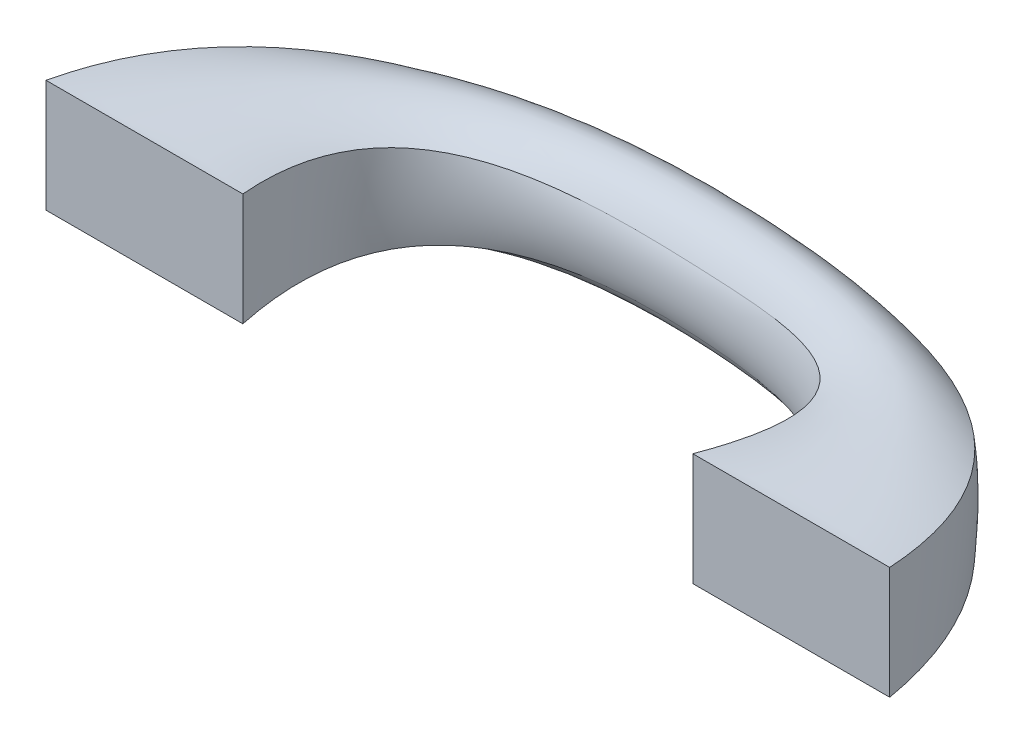
ISO-10303-21;
HEADER;
FILE_DESCRIPTION(('STEP AP214'),'2;1');
FILE_NAME('part.step','',(''),(''),'','','');
FILE_SCHEMA(('AUTOMOTIVE_DESIGN { 1 0 10303 214 1 1 1 1 }'));
ENDSEC;
DATA;
#1=APPLICATION_CONTEXT('core data for automotive mechanical design processes');
#2=APPLICATION_PROTOCOL_DEFINITION('international standard','automotive_design',2000,#1);
#3=PRODUCT_CONTEXT('',#1,'mechanical');
#4=PRODUCT('Part','Part','',(#3));
#5=PRODUCT_RELATED_PRODUCT_CATEGORY('part','',(#4));
#6=PRODUCT_DEFINITION_FORMATION('','',#4);
#7=PRODUCT_DEFINITION_CONTEXT('part definition',#1,'design');
#8=PRODUCT_DEFINITION('design','',#6,#7);
#9=PRODUCT_DEFINITION_SHAPE('','',#8);
#10=(LENGTH_UNIT() NAMED_UNIT(*) SI_UNIT(.MILLI.,.METRE.));
#11=(NAMED_UNIT(*) PLANE_ANGLE_UNIT() SI_UNIT($,.RADIAN.));
#12=(NAMED_UNIT(*) SI_UNIT($,.STERADIAN.) SOLID_ANGLE_UNIT());
#13=UNCERTAINTY_MEASURE_WITH_UNIT(LENGTH_MEASURE(1.E-05),#10,'distance_accuracy_value','');
#14=(GEOMETRIC_REPRESENTATION_CONTEXT(3) GLOBAL_UNCERTAINTY_ASSIGNED_CONTEXT((#13)) GLOBAL_UNIT_ASSIGNED_CONTEXT((#10,
#11,#12)) REPRESENTATION_CONTEXT('',''));
#15=CARTESIAN_POINT('',(0.,0.,0.));
#16=DIRECTION('',(0.,0.,1.));
#17=DIRECTION('',(1.,0.,0.));
#18=AXIS2_PLACEMENT_3D('',#15,#16,#17);
#19=CARTESIAN_POINT('',(0.,0.,0.));
#20=DIRECTION('',(0.,0.,1.));
#21=DIRECTION('',(1.,0.,0.));
#22=AXIS2_PLACEMENT_3D('',#19,#20,#21);
#23=PLANE('',#22);
#24=DIRECTION('',(0.,-1.,0.));
#25=VECTOR('',#24,1.);
#26=CARTESIAN_POINT('',(31.5014319167935,10.,0.));
#27=LINE('',#26,#25);
#28=CARTESIAN_POINT('',(31.5014319167935,10.,0.));
#29=VERTEX_POINT('',#28);
#30=CARTESIAN_POINT('',(31.5014319167935,-10.,0.));
#31=VERTEX_POINT('',#30);
#32=EDGE_CURVE('E211',#29,#31,#27,.T.);
#33=ORIENTED_EDGE('',*,*,#32,.T.);
#34=DIRECTION('',(1.,0.,0.));
#35=VECTOR('',#34,1.);
#36=CARTESIAN_POINT('',(31.5014319167935,-10.,0.));
#37=LINE('',#36,#35);
#38=CARTESIAN_POINT('',(66.5014319167935,-10.,0.));
#39=VERTEX_POINT('',#38);
#40=EDGE_CURVE('E215',#31,#39,#37,.T.);
#41=ORIENTED_EDGE('',*,*,#40,.T.);
#42=DIRECTION('',(0.,-1.,0.));
#43=VECTOR('',#42,1.);
#44=CARTESIAN_POINT('',(66.5014319167935,10.,0.));
#45=LINE('',#44,#43);
#46=CARTESIAN_POINT('',(66.5014319167935,10.,0.));
#47=VERTEX_POINT('',#46);
#48=EDGE_CURVE('E146',#47,#39,#45,.T.);
#49=ORIENTED_EDGE('',*,*,#48,.F.);
#50=DIRECTION('',(1.,0.,0.));
#51=VECTOR('',#50,1.);
#52=CARTESIAN_POINT('',(31.5014319167935,10.,0.));
#53=LINE('',#52,#51);
#54=EDGE_CURVE('E13',#29,#47,#53,.T.);
#55=ORIENTED_EDGE('',*,*,#54,.F.);
#56=EDGE_LOOP('',(#33,#41,#49,#55));
#57=FACE_BOUND('',#56,.T.);
#58=ADVANCED_FACE('F135',(#57),#23,.T.);
#59=CARTESIAN_POINT('',(0.,0.,0.));
#60=DIRECTION('',(0.,0.,1.));
#61=DIRECTION('',(1.,0.,0.));
#62=AXIS2_PLACEMENT_3D('',#59,#60,#61);
#63=PLANE('',#62);
#64=DIRECTION('',(0.,-1.,0.));
#65=VECTOR('',#64,1.);
#66=CARTESIAN_POINT('',(-83.4985680832065,10.,0.));
#67=LINE('',#66,#65);
#68=CARTESIAN_POINT('',(-83.4985680832065,10.,0.));
#69=VERTEX_POINT('',#68);
#70=CARTESIAN_POINT('',(-83.4985680832065,-10.,0.));
#71=VERTEX_POINT('',#70);
#72=EDGE_CURVE('E186',#69,#71,#67,.T.);
#73=ORIENTED_EDGE('',*,*,#72,.T.);
#74=DIRECTION('',(1.,0.,0.));
#75=VECTOR('',#74,1.);
#76=CARTESIAN_POINT('',(-83.4985680832065,-10.,0.));
#77=LINE('',#76,#75);
#78=CARTESIAN_POINT('',(-48.4985680832065,-10.,0.));
#79=VERTEX_POINT('',#78);
#80=EDGE_CURVE('E204',#71,#79,#77,.T.);
#81=ORIENTED_EDGE('',*,*,#80,.T.);
#82=DIRECTION('',(0.,-1.,0.));
#83=VECTOR('',#82,1.);
#84=CARTESIAN_POINT('',(-48.4985680832065,10.,0.));
#85=LINE('',#84,#83);
#86=CARTESIAN_POINT('',(-48.4985680832065,10.,0.));
#87=VERTEX_POINT('',#86);
#88=EDGE_CURVE('E188',#87,#79,#85,.T.);
#89=ORIENTED_EDGE('',*,*,#88,.F.);
#90=DIRECTION('',(1.,0.,0.));
#91=VECTOR('',#90,1.);
#92=CARTESIAN_POINT('',(-83.4985680832065,10.,0.));
#93=LINE('',#92,#91);
#94=EDGE_CURVE('E182',#69,#87,#93,.T.);
#95=ORIENTED_EDGE('',*,*,#94,.F.);
#96=EDGE_LOOP('',(#73,#81,#89,#95));
#97=FACE_BOUND('',#96,.T.);
#98=ADVANCED_FACE('F184',(#97),#63,.T.);
#99=CARTESIAN_POINT('',(-83.4985680832065,-10.,0.));
#100=CARTESIAN_POINT('',(-77.4919509848669,-7.56626341636347,-39.5340383100525));
#101=CARTESIAN_POINT('',(-3.86637231656519,-3.06805673692634,-55.9145125137412));
#102=CARTESIAN_POINT('',(62.3199675792694,-7.81936699573573,-34.8892264525427));
#103=CARTESIAN_POINT('',(66.5014319167935,-10.,0.));
#104=CARTESIAN_POINT('',(-83.4985680832065,-9.12859632873898,0.));
#105=CARTESIAN_POINT('',(-77.4919509848669,-6.95278307562805,-39.6322478950513));
#106=CARTESIAN_POINT('',(-3.86637231656519,-2.9312888127908,-56.1942401045079));
#107=CARTESIAN_POINT('',(62.3199675792694,-7.17906316120128,-34.9772224434907));
#108=CARTESIAN_POINT('',(66.5014319167935,-9.12859632873898,0.));
#109=CARTESIAN_POINT('',(-83.4985680832065,-7.42683665929627,0.));
#110=CARTESIAN_POINT('',(-77.4919509848669,-5.71784874571408,-39.8120681331774));
#111=CARTESIAN_POINT('',(-3.8663723165652,-2.55917459024483,-56.706417016596));
#112=CARTESIAN_POINT('',(62.3199675792694,-5.89557995990541,-35.1383417481554));
#113=CARTESIAN_POINT('',(66.5014319167935,-7.42683665929627,0.));
#114=CARTESIAN_POINT('',(-83.4985680832066,-4.94177169735341,0.));
#115=CARTESIAN_POINT('',(-77.491950984867,-3.83066059391897,-40.0154071138067));
#116=CARTESIAN_POINT('',(-3.86637231656515,-1.77702528241067,-57.2855816995656));
#117=CARTESIAN_POINT('',(62.3199675792694,-3.946213854387,-35.3205338946658));
#118=CARTESIAN_POINT('',(66.5014319167935,-4.94177169735341,0.));
#119=CARTESIAN_POINT('',(-83.4985680832065,-2.48199814475246,0.));
#120=CARTESIAN_POINT('',(-77.4919509848669,-1.91770637870666,-40.1388244817071));
#121=CARTESIAN_POINT('',(-3.86637231656521,-0.874741824430276,-57.6371079073383));
#122=CARTESIAN_POINT('',(62.3199675792694,-1.97639155719178,-35.4311161111441));
#123=CARTESIAN_POINT('',(66.5014319167935,-2.48199814475246,0.));
#124=CARTESIAN_POINT('',(-83.4985680832065,-0.833333333325745,0.));
#125=CARTESIAN_POINT('',(-77.4919509848669,-0.638278027895398,-40.1648307803328));
#126=CARTESIAN_POINT('',(-3.86637231656519,-0.277762808768679,-57.7111809141575));
#127=CARTESIAN_POINT('',(62.3199675792694,-0.658563376898207,-35.4544178084121));
#128=CARTESIAN_POINT('',(66.5014319167935,-0.833333333325745,0.));
#129=CARTESIAN_POINT('',(-83.4985680832065,0.833333333340919,0.));
#130=CARTESIAN_POINT('',(-77.4919509848669,0.638278027907019,-40.1648307803328));
#131=CARTESIAN_POINT('',(-3.86637231656519,0.277762808773733,-57.7111809141575));
#132=CARTESIAN_POINT('',(62.3199675792694,0.658563376910197,-35.4544178084122));
#133=CARTESIAN_POINT('',(66.5014319167935,0.833333333340919,0.));
#134=CARTESIAN_POINT('',(-83.4985680832065,2.48199814477665,0.));
#135=CARTESIAN_POINT('',(-77.4919509848669,1.91770637871702,-40.1388244817087));
#136=CARTESIAN_POINT('',(-3.86637231656515,0.874741824415085,-57.6371079073428));
#137=CARTESIAN_POINT('',(62.3199675792693,1.97639155720359,-35.4311161111456));
#138=CARTESIAN_POINT('',(66.5014319167934,2.48199814477665,0.));
#139=CARTESIAN_POINT('',(-83.4985680832066,4.94177169736052,0.));
#140=CARTESIAN_POINT('',(-77.491950984867,3.83066059393323,-40.0154071138077));
#141=CARTESIAN_POINT('',(-3.86637231656521,1.77702528243814,-57.2855816995685));
#142=CARTESIAN_POINT('',(62.3199675792695,3.94621385440051,-35.3205338946667));
#143=CARTESIAN_POINT('',(66.5014319167936,4.94177169736052,0.));
#144=CARTESIAN_POINT('',(-83.4985680832065,7.42683665928213,0.));
#145=CARTESIAN_POINT('',(-77.4919509848669,5.7178487457288,-39.8120681331745));
#146=CARTESIAN_POINT('',(-3.86637231656516,2.5591745903129,-56.7064170165877));
#147=CARTESIAN_POINT('',(62.3199675792693,5.89557995991713,-35.1383417481528));
#148=CARTESIAN_POINT('',(66.5014319167934,7.42683665928213,0.));
#149=CARTESIAN_POINT('',(-83.4985680832065,9.12859632872681,0.));
#150=CARTESIAN_POINT('',(-77.4919509848669,6.95278307563979,-39.6322478950489));
#151=CARTESIAN_POINT('',(-3.86637231656518,2.93128881284676,-56.1942401045012));
#152=CARTESIAN_POINT('',(62.3199675792694,7.17906316121054,-34.9772224434886));
#153=CARTESIAN_POINT('',(66.5014319167935,9.12859632872681,0.));
#154=CARTESIAN_POINT('',(-83.4985680832065,10.,0.));
#155=CARTESIAN_POINT('',(-77.4919509848669,7.56626341637603,-39.5340383100525));
#156=CARTESIAN_POINT('',(-3.86637231656519,3.06805673696212,-55.9145125137412));
#157=CARTESIAN_POINT('',(62.3199675792694,7.81936699574699,-34.8892264525427));
#158=CARTESIAN_POINT('',(66.5014319167935,10.,0.));
#159=B_SPLINE_SURFACE_WITH_KNOTS('',3,3,((#99,#100,#101,#102,#103),(#104,#105,#106,#107,#108),
(#109,#110,#111,#112,#113),(#114,#115,#116,#117,#118),(#119,#120,#121,#122,#123),(#124,#125,
#126,#127,#128),(#129,#130,#131,#132,#133),(#134,#135,#136,#137,#138),(#139,#140,#141,#142,
#143),(#144,#145,#146,#147,#148),(#149,#150,#151,#152,#153),(#154,#155,#156,#157,#158)),
.UNSPECIFIED.,.F.,.F.,.F.,(4,1,1,1,2,1,1,1,4),(4,1,4),(0.811441776840538,0.835011554735256,
0.858581332629974,0.882151110524693,0.905720888419411,0.929290666314558,0.952860444209706,
0.976430222104853,1.),(0.,0.541045967221112,1.),.UNSPECIFIED.);
#160=CARTESIAN_POINT('',(-83.4985680832065,10.,0.));
#161=CARTESIAN_POINT('',(-77.4919509848669,7.56626341637603,-39.5340383100525));
#162=CARTESIAN_POINT('',(-3.86637231656519,3.06805673696212,-55.9145125137412));
#163=CARTESIAN_POINT('',(62.3199675792694,7.81936699574699,-34.8892264525427));
#164=CARTESIAN_POINT('',(66.5014319167935,10.,0.));
#165=B_SPLINE_CURVE_WITH_KNOTS('',3,(#160,#161,#162,#163,#164),.UNSPECIFIED.,.F.,.F.,(4,1,4),
(0.,0.541045967221112,1.),.UNSPECIFIED.);
#166=EDGE_CURVE('E154',#69,#47,#165,.T.);
#167=CARTESIAN_POINT('',(-83.4985680832065,-10.,0.));
#168=CARTESIAN_POINT('',(-77.4919509848669,-7.56626341636347,-39.5340383100525));
#169=CARTESIAN_POINT('',(-3.86637231656519,-3.06805673692634,-55.9145125137412));
#170=CARTESIAN_POINT('',(62.3199675792694,-7.81936699573573,-34.8892264525427));
#171=CARTESIAN_POINT('',(66.5014319167935,-10.,0.));
#172=B_SPLINE_CURVE_WITH_KNOTS('',3,(#167,#168,#169,#170,#171),.UNSPECIFIED.,.F.,.F.,(4,1,4),
(0.,0.541045967221112,1.),.UNSPECIFIED.);
#173=EDGE_CURVE('E202',#71,#39,#172,.T.);
#174=ORIENTED_EDGE('',*,*,#72,.F.);
#175=ORIENTED_EDGE('',*,*,#166,.T.);
#176=ORIENTED_EDGE('',*,*,#48,.T.);
#177=ORIENTED_EDGE('',*,*,#173,.F.);
#178=EDGE_LOOP('',(#174,#175,#176,#177));
#179=FACE_BOUND('',#178,.T.);
#180=ADVANCED_FACE('F200',(#179),#159,.T.);
#181=CARTESIAN_POINT('',(-48.4985680832065,-10.,0.));
#182=CARTESIAN_POINT('',(-53.5940938497763,-7.56626341636347,-32.8484546423258));
#183=CARTESIAN_POINT('',(-0.488292681954813,-3.06805673692633,-36.8721531323634));
#184=CARTESIAN_POINT('',(39.3928458351145,-7.81936699573573,-28.8989296814636));
#185=CARTESIAN_POINT('',(31.5014319167935,-10.,0.));
#186=CARTESIAN_POINT('',(-49.9569014165398,-10.,0.));
#187=CARTESIAN_POINT('',(-54.5898378970717,-7.89369106204627,-33.0062733703706));
#188=CARTESIAN_POINT('',(-0.629046000063579,-4.0006596644147,-37.3216637638807));
#189=CARTESIAN_POINT('',(40.3481425744543,-8.11274284235985,-29.0403355876654));
#190=CARTESIAN_POINT('',(32.9597652501268,-10.,0.));
#191=CARTESIAN_POINT('',(-52.8735680832065,-10.,0.));
#192=CARTESIAN_POINT('',(-56.5813259916626,-8.51920788837742,-33.383995967095));
#193=CARTESIAN_POINT('',(-0.910552636281107,-5.78230159698014,-38.3975203817574));
#194=CARTESIAN_POINT('',(42.2587360531338,-8.67320721035739,-29.3787758142748));
#195=CARTESIAN_POINT('',(35.8764319167935,-10.,0.));
#196=CARTESIAN_POINT('',(-57.2485680832065,-10.,0.));
#197=CARTESIAN_POINT('',(-59.568558133549,-9.30980509677256,-34.1470019748194));
#198=CARTESIAN_POINT('',(-1.3328125906074,-8.0341373253771,-40.5707688715456));
#199=CARTESIAN_POINT('',(45.1246262711532,-9.38158394155218,-30.0624307726967));
#200=CARTESIAN_POINT('',(40.2514319167935,-10.,0.));
#201=CARTESIAN_POINT('',(-61.6235680832065,-10.,0.));
#202=CARTESIAN_POINT('',(-62.5557902754353,-9.86359850337151,-35.1014639604233));
#203=CARTESIAN_POINT('',(-1.75507254493371,-9.61149146461275,-43.2893360227533));
#204=CARTESIAN_POINT('',(47.9905164891726,-9.87778397737085,-30.9176306826284));
#205=CARTESIAN_POINT('',(44.6264319167935,-10.,0.));
#206=CARTESIAN_POINT('',(-65.9985680832065,-9.99999999999999,0.));
#207=CARTESIAN_POINT('',(-65.5430224173216,-10.0685601369482,-36.1912464761891));
#208=CARTESIAN_POINT('',(-2.17733249926001,-10.1952779042026,-46.3933328230522));
#209=CARTESIAN_POINT('',(50.856406707192,-10.0614300242727,-31.8940780670031));
#210=CARTESIAN_POINT('',(49.0014319167935,-9.99999999999999,0.));
#211=CARTESIAN_POINT('',(-70.3735680832065,-10.,0.));
#212=CARTESIAN_POINT('',(-68.5302545592079,-9.86359850337152,-37.2810289919551));
#213=CARTESIAN_POINT('',(-2.5995924535863,-9.61149146461277,-49.4973296233515));
#214=CARTESIAN_POINT('',(53.7222969252113,-9.87778397737085,-32.870525451378));
#215=CARTESIAN_POINT('',(53.3764319167935,-10.,0.));
#216=CARTESIAN_POINT('',(-74.7485680832065,-10.,0.));
#217=CARTESIAN_POINT('',(-71.5174867010943,-9.30980509677254,-38.2354909775588));
#218=CARTESIAN_POINT('',(-3.02185240791258,-8.03413732537705,-52.2158967745588));
#219=CARTESIAN_POINT('',(56.5881871432307,-9.38158394155217,-33.7257253613096));
#220=CARTESIAN_POINT('',(57.7514319167935,-10.,0.));
#221=CARTESIAN_POINT('',(-79.1235680832065,-10.,0.));
#222=CARTESIAN_POINT('',(-74.5047188429806,-8.51920788837744,-38.9984969852834));
#223=CARTESIAN_POINT('',(-3.44411236223889,-5.7823015969802,-54.3891452643473));
#224=CARTESIAN_POINT('',(59.45407736125,-8.67320721035741,-34.4093803197316));
#225=CARTESIAN_POINT('',(62.1264319167935,-10.,0.));
#226=CARTESIAN_POINT('',(-82.0402347498732,-10.,0.));
#227=CARTESIAN_POINT('',(-76.4962069375715,-7.89369106204628,-39.3762195820077));
#228=CARTESIAN_POINT('',(-3.72561899845642,-4.00065966441471,-55.4650018822239));
#229=CARTESIAN_POINT('',(61.3646708399296,-8.11274284235985,-34.7478205463409));
#230=CARTESIAN_POINT('',(65.0430985834602,-10.,0.));
#231=CARTESIAN_POINT('',(-83.4985680832065,-10.,0.));
#232=CARTESIAN_POINT('',(-77.4919509848669,-7.56626341636347,-39.5340383100525));
#233=CARTESIAN_POINT('',(-3.86637231656519,-3.06805673692634,-55.9145125137412));
#234=CARTESIAN_POINT('',(62.3199675792694,-7.81936699573573,-34.8892264525427));
#235=CARTESIAN_POINT('',(66.5014319167935,-10.,0.));
#236=B_SPLINE_SURFACE_WITH_KNOTS('',3,3,((#181,#182,#183,#184,#185),(#186,#187,#188,#189,#190),
(#191,#192,#193,#194,#195),(#196,#197,#198,#199,#200),(#201,#202,#203,#204,#205),(#206,#207,
#208,#209,#210),(#211,#212,#213,#214,#215),(#216,#217,#218,#219,#220),(#221,#222,#223,#224,
#225),(#226,#227,#228,#229,#230),(#231,#232,#233,#234,#235)),.UNSPECIFIED.,.F.,.F.,.F.,(4,1,1,1,
1,1,1,1,4),(4,1,4),(0.50000000373556,0.538930225373682,0.577860447011805,0.616790668649927,
0.655720890288049,0.694651111926171,0.733581333564293,0.772511555202416,0.811441776840538),(0.,
0.541045967221112,1.),.UNSPECIFIED.);
#237=CARTESIAN_POINT('',(-48.4985680832065,-10.,0.));
#238=CARTESIAN_POINT('',(-53.5940938497763,-7.56626341636347,-32.8484546423258));
#239=CARTESIAN_POINT('',(-0.488292681954813,-3.06805673692633,-36.8721531323634));
#240=CARTESIAN_POINT('',(39.3928458351145,-7.81936699573573,-28.8989296814636));
#241=CARTESIAN_POINT('',(31.5014319167935,-10.,0.));
#242=B_SPLINE_CURVE_WITH_KNOTS('',3,(#237,#238,#239,#240,#241),.UNSPECIFIED.,.F.,.F.,(4,1,4),
(0.,0.541045967221112,1.),.UNSPECIFIED.);
#243=EDGE_CURVE('E217',#79,#31,#242,.T.);
#244=ORIENTED_EDGE('',*,*,#80,.F.);
#245=ORIENTED_EDGE('',*,*,#173,.T.);
#246=ORIENTED_EDGE('',*,*,#40,.F.);
#247=ORIENTED_EDGE('',*,*,#243,.F.);
#248=EDGE_LOOP('',(#244,#245,#246,#247));
#249=FACE_BOUND('',#248,.T.);
#250=ADVANCED_FACE('F260',(#249),#236,.T.);
#251=CARTESIAN_POINT('',(-48.4985680832065,10.,0.));
#252=CARTESIAN_POINT('',(-53.5940938497763,7.56626341637603,-32.8484546423258));
#253=CARTESIAN_POINT('',(-0.488292681954813,3.06805673696212,-36.8721531323634));
#254=CARTESIAN_POINT('',(39.3928458351145,7.81936699574699,-28.8989296814636));
#255=CARTESIAN_POINT('',(31.5014319167935,10.,0.));
#256=CARTESIAN_POINT('',(-48.4985680832065,8.33333333333333,0.));
#257=CARTESIAN_POINT('',(-53.5940938497763,6.33859373445936,-32.6344380537606));
#258=CARTESIAN_POINT('',(-0.488292681954813,2.65177279922676,-36.2625757198917));
#259=CARTESIAN_POINT('',(39.3928458351145,6.54604253388374,-28.7071703761948));
#260=CARTESIAN_POINT('',(31.5014319167935,8.33333333333333,0.));
#261=CARTESIAN_POINT('',(-48.4985680832065,5.,0.));
#262=CARTESIAN_POINT('',(-53.5940938497763,3.82967072813545,-32.320339942412));
#263=CARTESIAN_POINT('',(-0.48829268195483,1.66658414627713,-35.3679389290632));
#264=CARTESIAN_POINT('',(39.3928458351145,3.95138255584297,-28.4257378198578));
#265=CARTESIAN_POINT('',(31.5014319167935,5.,0.));
#266=CARTESIAN_POINT('',(-48.4985680832066,0.,0.));
#267=CARTESIAN_POINT('',(-53.5940938497763,6.28143624882716E-12,-32.1663677565287));
#268=CARTESIAN_POINT('',(-0.488292681954793,1.79055655749593E-11,-34.9293842950855));
#269=CARTESIAN_POINT('',(39.3928458351145,5.62722502518409E-12,-28.2877784233753));
#270=CARTESIAN_POINT('',(31.5014319167935,0.,0.));
#271=CARTESIAN_POINT('',(-48.4985680832064,-5.,0.));
#272=CARTESIAN_POINT('',(-53.5940938497762,-3.82967072812289,-32.320339942412));
#273=CARTESIAN_POINT('',(-0.488292681954828,-1.66658414624134,-35.3679389290632));
#274=CARTESIAN_POINT('',(39.3928458351145,-3.95138255583171,-28.4257378198578));
#275=CARTESIAN_POINT('',(31.5014319167935,-5.,0.));
#276=CARTESIAN_POINT('',(-48.4985680832065,-8.33333333333334,0.));
#277=CARTESIAN_POINT('',(-53.5940938497763,-6.3385937344468,-32.6344380537606));
#278=CARTESIAN_POINT('',(-0.488292681954812,-2.65177279919097,-36.2625757198917));
#279=CARTESIAN_POINT('',(39.3928458351145,-6.54604253387249,-28.7071703761948));
#280=CARTESIAN_POINT('',(31.5014319167935,-8.33333333333334,0.));
#281=CARTESIAN_POINT('',(-48.4985680832065,-10.,0.));
#282=CARTESIAN_POINT('',(-53.5940938497763,-7.56626341636347,-32.8484546423258));
#283=CARTESIAN_POINT('',(-0.488292681954813,-3.06805673692633,-36.8721531323634));
#284=CARTESIAN_POINT('',(39.3928458351145,-7.81936699573573,-28.8989296814636));
#285=CARTESIAN_POINT('',(31.5014319167935,-10.,0.));
#286=B_SPLINE_SURFACE_WITH_KNOTS('',3,3,((#251,#252,#253,#254,#255),(#256,#257,#258,#259,#260),
(#261,#262,#263,#264,#265),(#266,#267,#268,#269,#270),(#271,#272,#273,#274,#275),(#276,#277,
#278,#279,#280),(#281,#282,#283,#284,#285)),.UNSPECIFIED.,.F.,.F.,.F.,(4,1,1,1,4),(4,1,4),
(0.311441773104978,0.358581330762624,0.405720888420269,0.452860446077914,0.50000000373556),(0.,
0.541045967221112,1.),.UNSPECIFIED.);
#287=CARTESIAN_POINT('',(-48.4985680832065,10.,0.));
#288=CARTESIAN_POINT('',(-53.5940938497763,7.56626341637603,-32.8484546423258));
#289=CARTESIAN_POINT('',(-0.488292681954813,3.06805673696212,-36.8721531323634));
#290=CARTESIAN_POINT('',(39.3928458351145,7.81936699574699,-28.8989296814636));
#291=CARTESIAN_POINT('',(31.5014319167935,10.,0.));
#292=B_SPLINE_CURVE_WITH_KNOTS('',3,(#287,#288,#289,#290,#291),.UNSPECIFIED.,.F.,.F.,(4,1,4),
(0.,0.541045967221112,1.),.UNSPECIFIED.);
#293=EDGE_CURVE('E194',#87,#29,#292,.T.);
#294=ORIENTED_EDGE('',*,*,#88,.T.);
#295=ORIENTED_EDGE('',*,*,#243,.T.);
#296=ORIENTED_EDGE('',*,*,#32,.F.);
#297=ORIENTED_EDGE('',*,*,#293,.F.);
#298=EDGE_LOOP('',(#294,#295,#296,#297));
#299=FACE_BOUND('',#298,.T.);
#300=ADVANCED_FACE('F249',(#299),#286,.T.);
#301=CARTESIAN_POINT('',(-83.4985680832065,10.,0.));
#302=CARTESIAN_POINT('',(-77.4919509848669,7.56626341637603,-39.5340383100525));
#303=CARTESIAN_POINT('',(-3.86637231656519,3.06805673696212,-55.9145125137412));
#304=CARTESIAN_POINT('',(62.3199675792694,7.81936699574699,-34.8892264525427));
#305=CARTESIAN_POINT('',(66.5014319167935,10.,0.));
#306=CARTESIAN_POINT('',(-82.0402347498732,10.,0.));
#307=CARTESIAN_POINT('',(-76.4962069375715,7.89369106205883,-39.3762195820077));
#308=CARTESIAN_POINT('',(-3.72561899845642,4.00065966445049,-55.4650018822239));
#309=CARTESIAN_POINT('',(61.3646708399296,8.11274284237111,-34.7478205463409));
#310=CARTESIAN_POINT('',(65.0430985834602,10.,0.));
#311=CARTESIAN_POINT('',(-79.1235680832065,10.,0.));
#312=CARTESIAN_POINT('',(-74.5047188429806,8.51920788838999,-38.9984969852833));
#313=CARTESIAN_POINT('',(-3.44411236223889,5.78230159701595,-54.3891452643471));
#314=CARTESIAN_POINT('',(59.45407736125,8.67320721036866,-34.4093803197315));
#315=CARTESIAN_POINT('',(62.1264319167935,10.,0.));
#316=CARTESIAN_POINT('',(-74.7485680832065,10.,0.));
#317=CARTESIAN_POINT('',(-71.5174867010943,9.30980509678511,-38.2354909775589));
#318=CARTESIAN_POINT('',(-3.02185240791259,8.03413732541286,-52.2158967745591));
#319=CARTESIAN_POINT('',(56.5881871432307,9.38158394156343,-33.7257253613097));
#320=CARTESIAN_POINT('',(57.7514319167935,10.,0.));
#321=CARTESIAN_POINT('',(-70.3735680832065,10.,0.));
#322=CARTESIAN_POINT('',(-68.530254559208,9.86359850338409,-37.281028991955));
#323=CARTESIAN_POINT('',(-2.59959245358629,9.61149146464855,-49.4973296233513));
#324=CARTESIAN_POINT('',(53.7222969252113,9.87778397738211,-32.870525451378));
#325=CARTESIAN_POINT('',(53.3764319167935,10.,0.));
#326=CARTESIAN_POINT('',(-65.9985680832065,10.,0.));
#327=CARTESIAN_POINT('',(-65.5430224173216,10.0685601369608,-36.1912464761891));
#328=CARTESIAN_POINT('',(-2.17733249926,10.1952779042384,-46.3933328230522));
#329=CARTESIAN_POINT('',(50.8564067071919,10.061430024284,-31.8940780670031));
#330=CARTESIAN_POINT('',(49.0014319167935,10.,0.));
#331=CARTESIAN_POINT('',(-61.6235680832065,10.,0.));
#332=CARTESIAN_POINT('',(-62.5557902754353,9.86359850338409,-35.1014639604234));
#333=CARTESIAN_POINT('',(-1.7550725449337,9.61149146464856,-43.2893360227534));
#334=CARTESIAN_POINT('',(47.9905164891726,9.87778397738211,-30.9176306826284));
#335=CARTESIAN_POINT('',(44.6264319167935,10.,0.));
#336=CARTESIAN_POINT('',(-57.2485680832065,10.,0.));
#337=CARTESIAN_POINT('',(-59.5685581335489,9.30980509678509,-34.1470019748194));
#338=CARTESIAN_POINT('',(-1.33281259060741,8.03413732541282,-40.5707688715455));
#339=CARTESIAN_POINT('',(45.1246262711532,9.38158394156342,-30.0624307726967));
#340=CARTESIAN_POINT('',(40.2514319167935,10.,0.));
#341=CARTESIAN_POINT('',(-52.8735680832065,10.,0.));
#342=CARTESIAN_POINT('',(-56.5813259916626,8.51920788839,-33.383995967095));
#343=CARTESIAN_POINT('',(-0.91055263628111,5.78230159701598,-38.3975203817574));
#344=CARTESIAN_POINT('',(42.2587360531338,8.67320721036866,-29.3787758142748));
#345=CARTESIAN_POINT('',(35.8764319167935,10.,0.));
#346=CARTESIAN_POINT('',(-49.9569014165399,10.,0.));
#347=CARTESIAN_POINT('',(-54.5898378970717,7.89369106205883,-33.0062733703706));
#348=CARTESIAN_POINT('',(-0.629046000063578,4.00065966445049,-37.3216637638807));
#349=CARTESIAN_POINT('',(40.3481425744543,8.11274284237111,-29.0403355876654));
#350=CARTESIAN_POINT('',(32.9597652501268,10.,0.));
#351=CARTESIAN_POINT('',(-48.4985680832065,10.,0.));
#352=CARTESIAN_POINT('',(-53.5940938497763,7.56626341637603,-32.8484546423258));
#353=CARTESIAN_POINT('',(-0.488292681954813,3.06805673696212,-36.8721531323634));
#354=CARTESIAN_POINT('',(39.3928458351145,7.81936699574699,-28.8989296814636));
#355=CARTESIAN_POINT('',(31.5014319167935,10.,0.));
#356=B_SPLINE_SURFACE_WITH_KNOTS('',3,3,((#301,#302,#303,#304,#305),(#306,#307,#308,#309,#310),
(#311,#312,#313,#314,#315),(#316,#317,#318,#319,#320),(#321,#322,#323,#324,#325),(#326,#327,
#328,#329,#330),(#331,#332,#333,#334,#335),(#336,#337,#338,#339,#340),(#341,#342,#343,#344,
#345),(#346,#347,#348,#349,#350),(#351,#352,#353,#354,#355)),.UNSPECIFIED.,.F.,.F.,.F.,(4,1,1,1,
1,1,1,1,4),(4,1,4),(0.,0.0389302216381223,0.0778604432762445,0.116790664914367,
0.155720886552489,0.194651108190611,0.233581329828734,0.272511551466856,0.311441773104978),(0.,
0.541045967221112,1.),.UNSPECIFIED.);
#357=ORIENTED_EDGE('',*,*,#94,.T.);
#358=ORIENTED_EDGE('',*,*,#293,.T.);
#359=ORIENTED_EDGE('',*,*,#54,.T.);
#360=ORIENTED_EDGE('',*,*,#166,.F.);
#361=EDGE_LOOP('',(#357,#358,#359,#360));
#362=FACE_BOUND('',#361,.T.);
#363=ADVANCED_FACE('F208',(#362),#356,.T.);
#364=CLOSED_SHELL('',(#58,#98,#180,#250,#300,#363));
#365=MANIFOLD_SOLID_BREP('B2',#364);
#366=ADVANCED_BREP_SHAPE_REPRESENTATION('',(#18,#365),#14);
#367=SHAPE_DEFINITION_REPRESENTATION(#9,#366);
ENDSEC;
END-ISO-10303-21;
